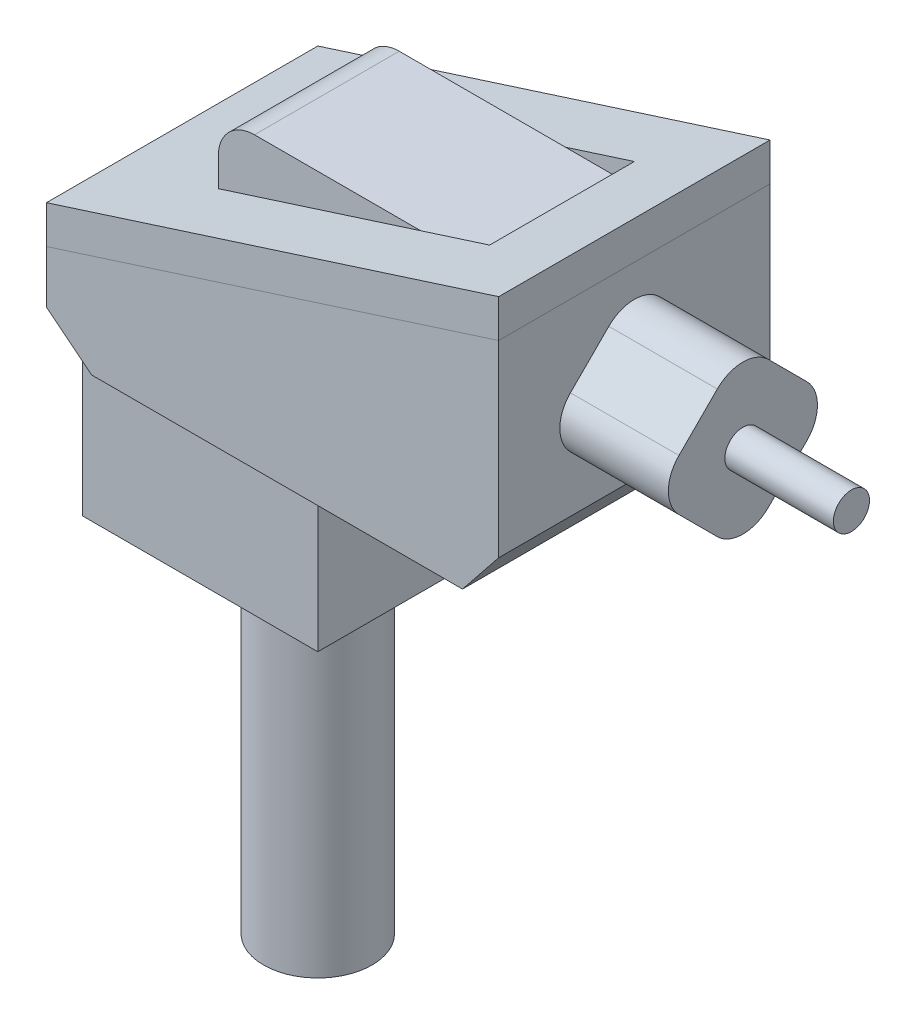
ISO-10303-21;
HEADER;
FILE_DESCRIPTION(('STEP AP214'),'2;1');
FILE_NAME('part.step','',(''),(''),'','','');
FILE_SCHEMA(('AUTOMOTIVE_DESIGN { 1 0 10303 214 1 1 1 1 }'));
ENDSEC;
DATA;
#1=APPLICATION_CONTEXT('core data for automotive mechanical design processes');
#2=APPLICATION_PROTOCOL_DEFINITION('international standard','automotive_design',2000,#1);
#3=PRODUCT_CONTEXT('',#1,'mechanical');
#4=PRODUCT('Part','Part','',(#3));
#5=PRODUCT_RELATED_PRODUCT_CATEGORY('part','',(#4));
#6=PRODUCT_DEFINITION_FORMATION('','',#4);
#7=PRODUCT_DEFINITION_CONTEXT('part definition',#1,'design');
#8=PRODUCT_DEFINITION('design','',#6,#7);
#9=PRODUCT_DEFINITION_SHAPE('','',#8);
#10=(LENGTH_UNIT() NAMED_UNIT(*) SI_UNIT(.MILLI.,.METRE.));
#11=(NAMED_UNIT(*) PLANE_ANGLE_UNIT() SI_UNIT($,.RADIAN.));
#12=(NAMED_UNIT(*) SI_UNIT($,.STERADIAN.) SOLID_ANGLE_UNIT());
#13=UNCERTAINTY_MEASURE_WITH_UNIT(LENGTH_MEASURE(1.E-05),#10,'distance_accuracy_value','');
#14=(GEOMETRIC_REPRESENTATION_CONTEXT(3) GLOBAL_UNCERTAINTY_ASSIGNED_CONTEXT((#13)) GLOBAL_UNIT_ASSIGNED_CONTEXT((#10,
#11,#12)) REPRESENTATION_CONTEXT('',''));
#15=CARTESIAN_POINT('',(0.,0.,0.));
#16=DIRECTION('',(0.,0.,1.));
#17=DIRECTION('',(1.,0.,0.));
#18=AXIS2_PLACEMENT_3D('',#15,#16,#17);
#19=CARTESIAN_POINT('',(-7.5,12.9000952402549,-7.51));
#20=DIRECTION('',(0.304775727103784,-0.952424147199324,0.));
#21=DIRECTION('',(0.952424147199324,0.304775727103784,0.));
#22=AXIS2_PLACEMENT_3D('',#19,#20,#21);
#23=PLANE('',#22);
#24=DIRECTION('',(0.,0.,-1.));
#25=VECTOR('',#24,1.);
#26=CARTESIAN_POINT('',(-7.5,12.9000952402549,7.5));
#27=LINE('',#26,#25);
#28=CARTESIAN_POINT('',(-7.5,12.9000952402549,7.5));
#29=VERTEX_POINT('',#28);
#30=CARTESIAN_POINT('',(-7.5,12.9000952402549,-7.5));
#31=VERTEX_POINT('',#30);
#32=EDGE_CURVE('E144',#29,#31,#27,.T.);
#33=ORIENTED_EDGE('',*,*,#32,.T.);
#34=DIRECTION('',(0.952424147199324,0.304775727103784,0.));
#35=VECTOR('',#34,1.);
#36=CARTESIAN_POINT('',(-4.44124680413786,13.8788962629308,-7.5));
#37=LINE('',#36,#35);
#38=CARTESIAN_POINT('',(17.5,20.9000952402549,-7.5));
#39=VERTEX_POINT('',#38);
#40=EDGE_CURVE('E130',#31,#39,#37,.T.);
#41=ORIENTED_EDGE('',*,*,#40,.T.);
#42=DIRECTION('',(0.,0.,1.));
#43=VECTOR('',#42,1.);
#44=CARTESIAN_POINT('',(17.5,20.9000952402549,7.5));
#45=LINE('',#44,#43);
#46=CARTESIAN_POINT('',(17.5,20.9000952402549,7.5));
#47=VERTEX_POINT('',#46);
#48=EDGE_CURVE('E139',#39,#47,#45,.T.);
#49=ORIENTED_EDGE('',*,*,#48,.T.);
#50=DIRECTION('',(0.952424147199324,0.304775727103784,0.));
#51=VECTOR('',#50,1.);
#52=CARTESIAN_POINT('',(-4.44124680413786,13.8788962629308,7.5));
#53=LINE('',#52,#51);
#54=EDGE_CURVE('E143',#29,#47,#53,.T.);
#55=ORIENTED_EDGE('',*,*,#54,.F.);
#56=EDGE_LOOP('',(#33,#41,#49,#55));
#57=FACE_BOUND('',#56,.T.);
#58=ADVANCED_FACE('F47',(#57),#23,.T.);
#59=CARTESIAN_POINT('',(17.5,10.5,7.5));
#60=DIRECTION('',(-1.,0.,0.));
#61=DIRECTION('',(0.,0.,1.));
#62=AXIS2_PLACEMENT_3D('',#59,#60,#61);
#63=PLANE('',#62);
#64=ORIENTED_EDGE('',*,*,#48,.F.);
#65=DIRECTION('',(0.,1.,0.));
#66=VECTOR('',#65,1.);
#67=CARTESIAN_POINT('',(17.5,10.5,-7.5));
#68=LINE('',#67,#66);
#69=CARTESIAN_POINT('',(17.5,23.,-7.5));
#70=VERTEX_POINT('',#69);
#71=EDGE_CURVE('E126',#39,#70,#68,.T.);
#72=ORIENTED_EDGE('',*,*,#71,.T.);
#73=DIRECTION('',(0.,0.,-1.));
#74=VECTOR('',#73,1.);
#75=CARTESIAN_POINT('',(17.5,23.,7.5));
#76=LINE('',#75,#74);
#77=CARTESIAN_POINT('',(17.5,23.,7.5));
#78=VERTEX_POINT('',#77);
#79=EDGE_CURVE('E153',#78,#70,#76,.T.);
#80=ORIENTED_EDGE('',*,*,#79,.F.);
#81=DIRECTION('',(0.,1.,0.));
#82=VECTOR('',#81,1.);
#83=CARTESIAN_POINT('',(17.5,10.5,7.5));
#84=LINE('',#83,#82);
#85=EDGE_CURVE('E141',#47,#78,#84,.T.);
#86=ORIENTED_EDGE('',*,*,#85,.F.);
#87=EDGE_LOOP('',(#64,#72,#80,#86));
#88=FACE_BOUND('',#87,.T.);
#89=ADVANCED_FACE('F140',(#88),#63,.F.);
#90=CARTESIAN_POINT('',(-7.5,15.,7.5));
#91=DIRECTION('',(1.,0.,0.));
#92=DIRECTION('',(0.,1.,0.));
#93=AXIS2_PLACEMENT_3D('',#90,#91,#92);
#94=PLANE('',#93);
#95=ORIENTED_EDGE('',*,*,#32,.F.);
#96=DIRECTION('',(0.,-1.,0.));
#97=VECTOR('',#96,1.);
#98=CARTESIAN_POINT('',(-7.5,15.,7.5));
#99=LINE('',#98,#97);
#100=CARTESIAN_POINT('',(-7.5,15.,7.5));
#101=VERTEX_POINT('',#100);
#102=EDGE_CURVE('E152',#101,#29,#99,.T.);
#103=ORIENTED_EDGE('',*,*,#102,.F.);
#104=DIRECTION('',(0.,0.,-1.));
#105=VECTOR('',#104,1.);
#106=CARTESIAN_POINT('',(-7.5,15.,7.5));
#107=LINE('',#106,#105);
#108=CARTESIAN_POINT('',(-7.5,15.,-7.5));
#109=VERTEX_POINT('',#108);
#110=EDGE_CURVE('E207',#101,#109,#107,.T.);
#111=ORIENTED_EDGE('',*,*,#110,.T.);
#112=DIRECTION('',(0.,-1.,0.));
#113=VECTOR('',#112,1.);
#114=CARTESIAN_POINT('',(-7.5,15.,-7.5));
#115=LINE('',#114,#113);
#116=EDGE_CURVE('E51',#109,#31,#115,.T.);
#117=ORIENTED_EDGE('',*,*,#116,.T.);
#118=EDGE_LOOP('',(#95,#103,#111,#117));
#119=FACE_BOUND('',#118,.T.);
#120=ADVANCED_FACE('F213',(#119),#94,.F.);
#121=CARTESIAN_POINT('',(0.,0.,7.5));
#122=DIRECTION('',(0.,0.,1.));
#123=DIRECTION('',(1.,0.,0.));
#124=AXIS2_PLACEMENT_3D('',#121,#122,#123);
#125=PLANE('',#124);
#126=ORIENTED_EDGE('',*,*,#102,.T.);
#127=ORIENTED_EDGE('',*,*,#54,.T.);
#128=ORIENTED_EDGE('',*,*,#85,.T.);
#129=DIRECTION('',(-0.952424147199324,-0.304775727103784,0.));
#130=VECTOR('',#129,1.);
#131=CARTESIAN_POINT('',(17.5,23.,7.5));
#132=LINE('',#131,#130);
#133=EDGE_CURVE('E136',#78,#101,#132,.T.);
#134=ORIENTED_EDGE('',*,*,#133,.T.);
#135=EDGE_LOOP('',(#126,#127,#128,#134));
#136=FACE_BOUND('',#135,.T.);
#137=ADVANCED_FACE('F49',(#136),#125,.T.);
#138=CARTESIAN_POINT('',(0.,0.,-7.5));
#139=DIRECTION('',(0.,0.,1.));
#140=DIRECTION('',(1.,0.,0.));
#141=AXIS2_PLACEMENT_3D('',#138,#139,#140);
#142=PLANE('',#141);
#143=ORIENTED_EDGE('',*,*,#40,.F.);
#144=ORIENTED_EDGE('',*,*,#116,.F.);
#145=DIRECTION('',(-0.952424147199324,-0.304775727103784,0.));
#146=VECTOR('',#145,1.);
#147=CARTESIAN_POINT('',(17.5,23.,-7.5));
#148=LINE('',#147,#146);
#149=EDGE_CURVE('E132',#70,#109,#148,.T.);
#150=ORIENTED_EDGE('',*,*,#149,.F.);
#151=ORIENTED_EDGE('',*,*,#71,.F.);
#152=EDGE_LOOP('',(#143,#144,#150,#151));
#153=FACE_BOUND('',#152,.T.);
#154=ADVANCED_FACE('F128',(#153),#142,.F.);
#155=CARTESIAN_POINT('',(17.5,23.,7.5));
#156=DIRECTION('',(0.304775727103784,-0.952424147199324,0.));
#157=DIRECTION('',(0.952424147199324,0.304775727103784,0.));
#158=AXIS2_PLACEMENT_3D('',#155,#156,#157);
#159=PLANE('',#158);
#160=ORIENTED_EDGE('',*,*,#149,.T.);
#161=ORIENTED_EDGE('',*,*,#110,.F.);
#162=ORIENTED_EDGE('',*,*,#133,.F.);
#163=ORIENTED_EDGE('',*,*,#79,.T.);
#164=EDGE_LOOP('',(#160,#161,#162,#163));
#165=FACE_BOUND('',#164,.T.);
#166=DIRECTION('',(0.952424147199324,0.304775727103784,0.));
#167=VECTOR('',#166,1.);
#168=CARTESIAN_POINT('',(17.5,23.,4.));
#169=LINE('',#168,#167);
#170=CARTESIAN_POINT('',(9.6875,20.5,4.));
#171=VERTEX_POINT('',#170);
#172=CARTESIAN_POINT('',(13.5,21.72,4.));
#173=VERTEX_POINT('',#172);
#174=EDGE_CURVE('E173',#171,#173,#169,.T.);
#175=ORIENTED_EDGE('',*,*,#174,.F.);
#176=DIRECTION('',(0.952424147199324,0.304775727103784,0.));
#177=VECTOR('',#176,1.);
#178=CARTESIAN_POINT('',(17.5,23.,4.));
#179=LINE('',#178,#177);
#180=CARTESIAN_POINT('',(-1.5,16.92,4.));
#181=VERTEX_POINT('',#180);
#182=EDGE_CURVE('E201',#181,#171,#179,.T.);
#183=ORIENTED_EDGE('',*,*,#182,.F.);
#184=DIRECTION('',(0.,0.,-1.));
#185=VECTOR('',#184,1.);
#186=CARTESIAN_POINT('',(-1.5,16.92,4.));
#187=LINE('',#186,#185);
#188=CARTESIAN_POINT('',(-1.5,16.92,-4.));
#189=VERTEX_POINT('',#188);
#190=EDGE_CURVE('E163',#181,#189,#187,.T.);
#191=ORIENTED_EDGE('',*,*,#190,.T.);
#192=DIRECTION('',(0.952424147199324,0.304775727103784,0.));
#193=VECTOR('',#192,1.);
#194=CARTESIAN_POINT('',(17.5,23.,-4.));
#195=LINE('',#194,#193);
#196=CARTESIAN_POINT('',(9.68750000000001,20.5,-4.));
#197=VERTEX_POINT('',#196);
#198=EDGE_CURVE('E204',#189,#197,#195,.T.);
#199=ORIENTED_EDGE('',*,*,#198,.T.);
#200=DIRECTION('',(-0.952424147199324,-0.304775727103784,0.));
#201=VECTOR('',#200,1.);
#202=CARTESIAN_POINT('',(17.5,23.,-4.));
#203=LINE('',#202,#201);
#204=CARTESIAN_POINT('',(13.5,21.72,-4.));
#205=VERTEX_POINT('',#204);
#206=EDGE_CURVE('E178',#205,#197,#203,.T.);
#207=ORIENTED_EDGE('',*,*,#206,.F.);
#208=DIRECTION('',(0.,0.,-1.));
#209=VECTOR('',#208,1.);
#210=CARTESIAN_POINT('',(13.5,21.72,7.5));
#211=LINE('',#210,#209);
#212=EDGE_CURVE('E199',#173,#205,#211,.T.);
#213=ORIENTED_EDGE('',*,*,#212,.F.);
#214=EDGE_LOOP('',(#175,#183,#191,#199,#207,#213));
#215=FACE_BOUND('',#214,.T.);
#216=ADVANCED_FACE('F210',(#165,#215),#159,.F.);
#217=CARTESIAN_POINT('',(0.,0.,4.));
#218=DIRECTION('',(0.,0.,-1.));
#219=DIRECTION('',(-1.,0.,0.));
#220=AXIS2_PLACEMENT_3D('',#217,#218,#219);
#221=PLANE('',#220);
#222=DIRECTION('',(-1.,0.,0.));
#223=VECTOR('',#222,1.);
#224=CARTESIAN_POINT('',(9.68750000000001,20.5,4.));
#225=LINE('',#224,#223);
#226=CARTESIAN_POINT('',(0.500000000000006,20.5,4.));
#227=VERTEX_POINT('',#226);
#228=EDGE_CURVE('E170',#171,#227,#225,.T.);
#229=ORIENTED_EDGE('',*,*,#228,.T.);
#230=CARTESIAN_POINT('',(0.500000000000002,18.5,4.));
#231=DIRECTION('',(0.,0.,-1.));
#232=DIRECTION('',(-1.,0.,0.));
#233=AXIS2_PLACEMENT_3D('',#230,#231,#232);
#234=CIRCLE('',#233,2.);
#235=CARTESIAN_POINT('',(-1.5,18.5,4.));
#236=VERTEX_POINT('',#235);
#237=EDGE_CURVE('E186',#227,#236,#234,.F.);
#238=ORIENTED_EDGE('',*,*,#237,.T.);
#239=DIRECTION('',(0.,-1.,0.));
#240=VECTOR('',#239,1.);
#241=CARTESIAN_POINT('',(-1.5,20.5,4.));
#242=LINE('',#241,#240);
#243=EDGE_CURVE('E166',#236,#181,#242,.T.);
#244=ORIENTED_EDGE('',*,*,#243,.T.);
#245=ORIENTED_EDGE('',*,*,#182,.T.);
#246=EDGE_LOOP('',(#229,#238,#244,#245));
#247=FACE_BOUND('',#246,.T.);
#248=ADVANCED_FACE('F226',(#247),#221,.F.);
#249=CARTESIAN_POINT('',(0.,0.,-4.));
#250=DIRECTION('',(0.,0.,-1.));
#251=DIRECTION('',(-1.,0.,0.));
#252=AXIS2_PLACEMENT_3D('',#249,#250,#251);
#253=PLANE('',#252);
#254=DIRECTION('',(0.,-1.,0.));
#255=VECTOR('',#254,1.);
#256=CARTESIAN_POINT('',(-1.5,20.5,-4.));
#257=LINE('',#256,#255);
#258=CARTESIAN_POINT('',(-1.5,18.5,-4.));
#259=VERTEX_POINT('',#258);
#260=EDGE_CURVE('E167',#259,#189,#257,.T.);
#261=ORIENTED_EDGE('',*,*,#260,.F.);
#262=CARTESIAN_POINT('',(0.500000000000002,18.5,-4.));
#263=DIRECTION('',(0.,0.,-1.));
#264=DIRECTION('',(-1.,0.,0.));
#265=AXIS2_PLACEMENT_3D('',#262,#263,#264);
#266=CIRCLE('',#265,2.);
#267=CARTESIAN_POINT('',(0.500000000000006,20.5,-4.));
#268=VERTEX_POINT('',#267);
#269=EDGE_CURVE('E192',#259,#268,#266,.T.);
#270=ORIENTED_EDGE('',*,*,#269,.T.);
#271=DIRECTION('',(-1.,0.,0.));
#272=VECTOR('',#271,1.);
#273=CARTESIAN_POINT('',(9.68750000000001,20.5,-4.));
#274=LINE('',#273,#272);
#275=EDGE_CURVE('E169',#197,#268,#274,.T.);
#276=ORIENTED_EDGE('',*,*,#275,.F.);
#277=ORIENTED_EDGE('',*,*,#198,.F.);
#278=EDGE_LOOP('',(#261,#270,#276,#277));
#279=FACE_BOUND('',#278,.T.);
#280=ADVANCED_FACE('F231',(#279),#253,.T.);
#281=CARTESIAN_POINT('',(9.68750000000001,20.5,4.));
#282=DIRECTION('',(0.,-1.,0.));
#283=DIRECTION('',(0.,0.,-1.));
#284=AXIS2_PLACEMENT_3D('',#281,#282,#283);
#285=PLANE('',#284);
#286=ORIENTED_EDGE('',*,*,#275,.T.);
#287=DIRECTION('',(0.,0.,-1.));
#288=VECTOR('',#287,1.);
#289=CARTESIAN_POINT('',(0.500000000000002,20.5,4.));
#290=LINE('',#289,#288);
#291=EDGE_CURVE('E187',#268,#227,#290,.F.);
#292=ORIENTED_EDGE('',*,*,#291,.T.);
#293=ORIENTED_EDGE('',*,*,#228,.F.);
#294=DIRECTION('',(1.,0.,0.));
#295=VECTOR('',#294,1.);
#296=CARTESIAN_POINT('',(-1.5,20.5,4.));
#297=LINE('',#296,#295);
#298=CARTESIAN_POINT('',(13.5,20.5,4.));
#299=VERTEX_POINT('',#298);
#300=EDGE_CURVE('E12',#171,#299,#297,.T.);
#301=ORIENTED_EDGE('',*,*,#300,.T.);
#302=DIRECTION('',(0.,0.,-1.));
#303=VECTOR('',#302,1.);
#304=CARTESIAN_POINT('',(13.5,20.5,-4.));
#305=LINE('',#304,#303);
#306=CARTESIAN_POINT('',(13.5,20.5,-4.));
#307=VERTEX_POINT('',#306);
#308=EDGE_CURVE('E56',#299,#307,#305,.T.);
#309=ORIENTED_EDGE('',*,*,#308,.T.);
#310=DIRECTION('',(-1.,0.,0.));
#311=VECTOR('',#310,1.);
#312=CARTESIAN_POINT('',(-1.5,20.5,-4.));
#313=LINE('',#312,#311);
#314=EDGE_CURVE('E183',#307,#197,#313,.T.);
#315=ORIENTED_EDGE('',*,*,#314,.T.);
#316=EDGE_LOOP('',(#286,#292,#293,#301,#309,#315));
#317=FACE_BOUND('',#316,.T.);
#318=ADVANCED_FACE('F236',(#317),#285,.F.);
#319=CARTESIAN_POINT('',(-1.5,20.5,4.));
#320=DIRECTION('',(1.,0.,0.));
#321=DIRECTION('',(0.,0.,-1.));
#322=AXIS2_PLACEMENT_3D('',#319,#320,#321);
#323=PLANE('',#322);
#324=ORIENTED_EDGE('',*,*,#243,.F.);
#325=DIRECTION('',(0.,0.,-1.));
#326=VECTOR('',#325,1.);
#327=CARTESIAN_POINT('',(-1.5,18.5,4.));
#328=LINE('',#327,#326);
#329=EDGE_CURVE('E196',#236,#259,#328,.T.);
#330=ORIENTED_EDGE('',*,*,#329,.T.);
#331=ORIENTED_EDGE('',*,*,#260,.T.);
#332=ORIENTED_EDGE('',*,*,#190,.F.);
#333=EDGE_LOOP('',(#324,#330,#331,#332));
#334=FACE_BOUND('',#333,.T.);
#335=ADVANCED_FACE('F239',(#334),#323,.F.);
#336=CARTESIAN_POINT('',(13.5,23.,-4.));
#337=DIRECTION('',(-1.,0.,0.));
#338=DIRECTION('',(0.,0.,1.));
#339=AXIS2_PLACEMENT_3D('',#336,#337,#338);
#340=PLANE('',#339);
#341=ORIENTED_EDGE('',*,*,#212,.T.);
#342=DIRECTION('',(0.,-1.,0.));
#343=VECTOR('',#342,1.);
#344=CARTESIAN_POINT('',(13.5,23.,-4.));
#345=LINE('',#344,#343);
#346=EDGE_CURVE('E71',#205,#307,#345,.T.);
#347=ORIENTED_EDGE('',*,*,#346,.T.);
#348=ORIENTED_EDGE('',*,*,#308,.F.);
#349=DIRECTION('',(0.,-1.,0.));
#350=VECTOR('',#349,1.);
#351=CARTESIAN_POINT('',(13.5,23.,4.));
#352=LINE('',#351,#350);
#353=EDGE_CURVE('E64',#173,#299,#352,.T.);
#354=ORIENTED_EDGE('',*,*,#353,.F.);
#355=EDGE_LOOP('',(#341,#347,#348,#354));
#356=FACE_BOUND('',#355,.T.);
#357=ADVANCED_FACE('F243',(#356),#340,.T.);
#358=CARTESIAN_POINT('',(-1.5,23.,4.));
#359=DIRECTION('',(0.,0.,-1.));
#360=DIRECTION('',(-1.,0.,0.));
#361=AXIS2_PLACEMENT_3D('',#358,#359,#360);
#362=PLANE('',#361);
#363=ORIENTED_EDGE('',*,*,#174,.T.);
#364=ORIENTED_EDGE('',*,*,#353,.T.);
#365=ORIENTED_EDGE('',*,*,#300,.F.);
#366=EDGE_LOOP('',(#363,#364,#365));
#367=FACE_BOUND('',#366,.T.);
#368=ADVANCED_FACE('F248',(#367),#362,.T.);
#369=CARTESIAN_POINT('',(-1.5,23.,-4.));
#370=DIRECTION('',(0.,0.,1.));
#371=DIRECTION('',(1.,0.,0.));
#372=AXIS2_PLACEMENT_3D('',#369,#370,#371);
#373=PLANE('',#372);
#374=ORIENTED_EDGE('',*,*,#206,.T.);
#375=ORIENTED_EDGE('',*,*,#314,.F.);
#376=ORIENTED_EDGE('',*,*,#346,.F.);
#377=EDGE_LOOP('',(#374,#375,#376));
#378=FACE_BOUND('',#377,.T.);
#379=ADVANCED_FACE('F251',(#378),#373,.T.);
#380=CARTESIAN_POINT('',(0.500000000000002,18.5,4.));
#381=DIRECTION('',(0.,0.,-1.));
#382=DIRECTION('',(-1.,0.,0.));
#383=AXIS2_PLACEMENT_3D('',#380,#381,#382);
#384=CYLINDRICAL_SURFACE('',#383,2.);
#385=ORIENTED_EDGE('',*,*,#237,.F.);
#386=ORIENTED_EDGE('',*,*,#291,.F.);
#387=ORIENTED_EDGE('',*,*,#269,.F.);
#388=ORIENTED_EDGE('',*,*,#329,.F.);
#389=EDGE_LOOP('',(#385,#386,#387,#388));
#390=FACE_BOUND('',#389,.T.);
#391=ADVANCED_FACE('F235',(#390),#384,.T.);
#392=CLOSED_SHELL('',(#58,#89,#120,#137,#154,#216,#248,#280,#318,#335,#357,#368,#379,#391));
#393=MANIFOLD_SOLID_BREP('B2',#392);
#394=CARTESIAN_POINT('',(-7.5,12.9000952402549,-7.51));
#395=DIRECTION('',(0.304775727103784,-0.952424147199324,0.));
#396=DIRECTION('',(0.952424147199324,0.304775727103784,0.));
#397=AXIS2_PLACEMENT_3D('',#394,#395,#396);
#398=PLANE('',#397);
#399=DIRECTION('',(0.,0.,-1.));
#400=VECTOR('',#399,1.);
#401=CARTESIAN_POINT('',(-7.5,12.9000952402549,7.5));
#402=LINE('',#401,#400);
#403=CARTESIAN_POINT('',(-7.5,12.9000952402549,7.5));
#404=VERTEX_POINT('',#403);
#405=CARTESIAN_POINT('',(-7.5,12.9000952402549,-7.5));
#406=VERTEX_POINT('',#405);
#407=EDGE_CURVE('E612',#404,#406,#402,.T.);
#408=ORIENTED_EDGE('',*,*,#407,.F.);
#409=DIRECTION('',(0.952424147199324,0.304775727103784,0.));
#410=VECTOR('',#409,1.);
#411=CARTESIAN_POINT('',(-4.44124680413786,13.8788962629308,7.5));
#412=LINE('',#411,#410);
#413=CARTESIAN_POINT('',(17.5,20.9000952402549,7.5));
#414=VERTEX_POINT('',#413);
#415=EDGE_CURVE('E45',#404,#414,#412,.T.);
#416=ORIENTED_EDGE('',*,*,#415,.T.);
#417=DIRECTION('',(0.,0.,1.));
#418=VECTOR('',#417,1.);
#419=CARTESIAN_POINT('',(17.5,20.9000952402549,7.5));
#420=LINE('',#419,#418);
#421=CARTESIAN_POINT('',(17.5,20.9000952402549,-7.5));
#422=VERTEX_POINT('',#421);
#423=EDGE_CURVE('E357',#422,#414,#420,.T.);
#424=ORIENTED_EDGE('',*,*,#423,.F.);
#425=DIRECTION('',(0.952424147199324,0.304775727103784,0.));
#426=VECTOR('',#425,1.);
#427=CARTESIAN_POINT('',(-4.44124680413786,13.8788962629308,-7.5));
#428=LINE('',#427,#426);
#429=EDGE_CURVE('E611',#406,#422,#428,.T.);
#430=ORIENTED_EDGE('',*,*,#429,.F.);
#431=EDGE_LOOP('',(#408,#416,#424,#430));
#432=FACE_BOUND('',#431,.T.);
#433=ADVANCED_FACE('F354',(#432),#398,.F.);
#434=CARTESIAN_POINT('',(0.,-20.,0.));
#435=DIRECTION('',(0.,1.,0.));
#436=DIRECTION('',(0.,0.,1.));
#437=AXIS2_PLACEMENT_3D('',#434,#435,#436);
#438=PLANE('',#437);
#439=CARTESIAN_POINT('',(0.,-20.,0.));
#440=DIRECTION('',(0.,1.,0.));
#441=DIRECTION('',(0.,0.,1.));
#442=AXIS2_PLACEMENT_3D('',#439,#440,#441);
#443=CIRCLE('',#442,3.);
#444=CARTESIAN_POINT('',(0.,-20.,3.));
#445=VERTEX_POINT('',#444);
#446=EDGE_CURVE('E566',#445,#445,#443,.T.);
#447=ORIENTED_EDGE('',*,*,#446,.F.);
#448=EDGE_LOOP('',(#447));
#449=FACE_BOUND('',#448,.T.);
#450=ADVANCED_FACE('F727',(#449),#438,.F.);
#451=CARTESIAN_POINT('',(29.5,15.,0.));
#452=DIRECTION('',(1.,0.,0.));
#453=DIRECTION('',(0.,0.,-1.));
#454=AXIS2_PLACEMENT_3D('',#451,#452,#453);
#455=PLANE('',#454);
#456=CARTESIAN_POINT('',(29.5,15.,0.));
#457=DIRECTION('',(1.,0.,0.));
#458=DIRECTION('',(0.,0.,-1.));
#459=AXIS2_PLACEMENT_3D('',#456,#457,#458);
#460=CIRCLE('',#459,1.);
#461=CARTESIAN_POINT('',(29.5,15.,-1.));
#462=VERTEX_POINT('',#461);
#463=EDGE_CURVE('E674',#462,#462,#460,.T.);
#464=ORIENTED_EDGE('',*,*,#463,.T.);
#465=EDGE_LOOP('',(#464));
#466=FACE_BOUND('',#465,.T.);
#467=ADVANCED_FACE('F732',(#466),#455,.T.);
#468=CARTESIAN_POINT('',(0.,-20.,0.));
#469=DIRECTION('',(0.,1.,0.));
#470=DIRECTION('',(0.,0.,1.));
#471=AXIS2_PLACEMENT_3D('',#468,#469,#470);
#472=CYLINDRICAL_SURFACE('',#471,3.);
#473=ORIENTED_EDGE('',*,*,#446,.T.);
#474=EDGE_LOOP('',(#473));
#475=FACE_BOUND('',#474,.T.);
#476=CARTESIAN_POINT('',(0.,0.,0.));
#477=DIRECTION('',(0.,1.,0.));
#478=DIRECTION('',(0.,0.,1.));
#479=AXIS2_PLACEMENT_3D('',#476,#477,#478);
#480=CIRCLE('',#479,3.);
#481=CARTESIAN_POINT('',(0.,0.,3.));
#482=VERTEX_POINT('',#481);
#483=EDGE_CURVE('E565',#482,#482,#480,.T.);
#484=ORIENTED_EDGE('',*,*,#483,.F.);
#485=EDGE_LOOP('',(#484));
#486=FACE_BOUND('',#485,.T.);
#487=ADVANCED_FACE('F767',(#475,#486),#472,.T.);
#488=CARTESIAN_POINT('',(29.5,15.,0.));
#489=DIRECTION('',(-1.,0.,0.));
#490=DIRECTION('',(0.,0.,1.));
#491=AXIS2_PLACEMENT_3D('',#488,#489,#490);
#492=CYLINDRICAL_SURFACE('',#491,1.);
#493=ORIENTED_EDGE('',*,*,#463,.F.);
#494=EDGE_LOOP('',(#493));
#495=FACE_BOUND('',#494,.T.);
#496=CARTESIAN_POINT('',(23.5,15.,0.));
#497=DIRECTION('',(-1.,0.,0.));
#498=DIRECTION('',(0.,0.,1.));
#499=AXIS2_PLACEMENT_3D('',#496,#497,#498);
#500=CIRCLE('',#499,1.);
#501=CARTESIAN_POINT('',(23.5,15.,1.));
#502=VERTEX_POINT('',#501);
#503=EDGE_CURVE('E571',#502,#502,#500,.F.);
#504=ORIENTED_EDGE('',*,*,#503,.T.);
#505=EDGE_LOOP('',(#504));
#506=FACE_BOUND('',#505,.T.);
#507=ADVANCED_FACE('F760',(#495,#506),#492,.T.);
#508=CARTESIAN_POINT('',(-6.5,8.,6.5));
#509=DIRECTION('',(1.,0.,0.));
#510=DIRECTION('',(0.,0.,-1.));
#511=AXIS2_PLACEMENT_3D('',#508,#509,#510);
#512=PLANE('',#511);
#513=DIRECTION('',(0.,0.,1.));
#514=VECTOR('',#513,1.);
#515=CARTESIAN_POINT('',(-6.5,0.,6.5));
#516=LINE('',#515,#514);
#517=CARTESIAN_POINT('',(-6.5,0.,-6.5));
#518=VERTEX_POINT('',#517);
#519=CARTESIAN_POINT('',(-6.5,0.,6.5));
#520=VERTEX_POINT('',#519);
#521=EDGE_CURVE('E551',#518,#520,#516,.T.);
#522=ORIENTED_EDGE('',*,*,#521,.T.);
#523=DIRECTION('',(0.,-1.,0.));
#524=VECTOR('',#523,1.);
#525=CARTESIAN_POINT('',(-6.5,8.,6.5));
#526=LINE('',#525,#524);
#527=CARTESIAN_POINT('',(-6.5,8.,6.5));
#528=VERTEX_POINT('',#527);
#529=EDGE_CURVE('E556',#528,#520,#526,.T.);
#530=ORIENTED_EDGE('',*,*,#529,.F.);
#531=DIRECTION('',(0.,0.,1.));
#532=VECTOR('',#531,1.);
#533=CARTESIAN_POINT('',(-6.5,8.,6.5));
#534=LINE('',#533,#532);
#535=CARTESIAN_POINT('',(-6.5,8.,-6.5));
#536=VERTEX_POINT('',#535);
#537=EDGE_CURVE('E540',#536,#528,#534,.T.);
#538=ORIENTED_EDGE('',*,*,#537,.F.);
#539=DIRECTION('',(0.,-1.,0.));
#540=VECTOR('',#539,1.);
#541=CARTESIAN_POINT('',(-6.5,8.,-6.5));
#542=LINE('',#541,#540);
#543=EDGE_CURVE('E559',#536,#518,#542,.T.);
#544=ORIENTED_EDGE('',*,*,#543,.T.);
#545=EDGE_LOOP('',(#522,#530,#538,#544));
#546=FACE_BOUND('',#545,.T.);
#547=ADVANCED_FACE('F636',(#546),#512,.F.);
#548=CARTESIAN_POINT('',(0.,0.,0.));
#549=DIRECTION('',(0.,-1.,0.));
#550=DIRECTION('',(0.,0.,-1.));
#551=AXIS2_PLACEMENT_3D('',#548,#549,#550);
#552=PLANE('',#551);
#553=ORIENTED_EDGE('',*,*,#483,.T.);
#554=EDGE_LOOP('',(#553));
#555=FACE_BOUND('',#554,.T.);
#556=DIRECTION('',(0.,0.,-1.));
#557=VECTOR('',#556,1.);
#558=CARTESIAN_POINT('',(6.5,0.,6.5));
#559=LINE('',#558,#557);
#560=CARTESIAN_POINT('',(6.5,0.,6.5));
#561=VERTEX_POINT('',#560);
#562=CARTESIAN_POINT('',(6.5,0.,-6.5));
#563=VERTEX_POINT('',#562);
#564=EDGE_CURVE('E500',#561,#563,#559,.T.);
#565=ORIENTED_EDGE('',*,*,#564,.F.);
#566=DIRECTION('',(1.,0.,0.));
#567=VECTOR('',#566,1.);
#568=CARTESIAN_POINT('',(-6.5,0.,6.5));
#569=LINE('',#568,#567);
#570=EDGE_CURVE('E536',#520,#561,#569,.T.);
#571=ORIENTED_EDGE('',*,*,#570,.F.);
#572=ORIENTED_EDGE('',*,*,#521,.F.);
#573=DIRECTION('',(-1.,0.,0.));
#574=VECTOR('',#573,1.);
#575=CARTESIAN_POINT('',(-6.5,0.,-6.5));
#576=LINE('',#575,#574);
#577=EDGE_CURVE('E549',#563,#518,#576,.T.);
#578=ORIENTED_EDGE('',*,*,#577,.F.);
#579=EDGE_LOOP('',(#565,#571,#572,#578));
#580=FACE_BOUND('',#579,.T.);
#581=ADVANCED_FACE('F752',(#555,#580),#552,.T.);
#582=CARTESIAN_POINT('',(23.5,0.,0.));
#583=DIRECTION('',(-1.,0.,0.));
#584=DIRECTION('',(0.,0.,1.));
#585=AXIS2_PLACEMENT_3D('',#582,#583,#584);
#586=PLANE('',#585);
#587=DIRECTION('',(0.,-0.707106781186548,-0.707106781186548));
#588=VECTOR('',#587,1.);
#589=CARTESIAN_POINT('',(23.5,15.,4.94974746830584));
#590=LINE('',#589,#588);
#591=CARTESIAN_POINT('',(23.5,13.5857864376269,3.53553390593274));
#592=VERTEX_POINT('',#591);
#593=CARTESIAN_POINT('',(23.5,11.4644660940673,1.4142135623731));
#594=VERTEX_POINT('',#593);
#595=EDGE_CURVE('E668',#592,#594,#590,.T.);
#596=ORIENTED_EDGE('',*,*,#595,.T.);
#597=CARTESIAN_POINT('',(23.5,12.8786796564404,0.));
#598=DIRECTION('',(-1.,0.,0.));
#599=DIRECTION('',(0.,0.,1.));
#600=AXIS2_PLACEMENT_3D('',#597,#598,#599);
#601=CIRCLE('',#600,2.);
#602=CARTESIAN_POINT('',(23.5,11.4644660940673,-1.41421356237309));
#603=VERTEX_POINT('',#602);
#604=EDGE_CURVE('E591',#594,#603,#601,.F.);
#605=ORIENTED_EDGE('',*,*,#604,.T.);
#606=DIRECTION('',(0.,0.707106781186548,-0.707106781186547));
#607=VECTOR('',#606,1.);
#608=CARTESIAN_POINT('',(23.5,10.0502525316942,0.));
#609=LINE('',#608,#607);
#610=CARTESIAN_POINT('',(23.5,13.5857864376269,-3.53553390593274));
#611=VERTEX_POINT('',#610);
#612=EDGE_CURVE('E683',#603,#611,#609,.T.);
#613=ORIENTED_EDGE('',*,*,#612,.T.);
#614=CARTESIAN_POINT('',(23.5,15.,-2.12132034355964));
#615=DIRECTION('',(-1.,0.,0.));
#616=DIRECTION('',(0.,0.,1.));
#617=AXIS2_PLACEMENT_3D('',#614,#615,#616);
#618=CIRCLE('',#617,2.);
#619=CARTESIAN_POINT('',(23.5,16.4142135623731,-3.53553390593273));
#620=VERTEX_POINT('',#619);
#621=EDGE_CURVE('E589',#611,#620,#618,.F.);
#622=ORIENTED_EDGE('',*,*,#621,.T.);
#623=DIRECTION('',(0.,0.707106781186548,0.707106781186547));
#624=VECTOR('',#623,1.);
#625=CARTESIAN_POINT('',(23.5,19.9497474683058,0.));
#626=LINE('',#625,#624);
#627=CARTESIAN_POINT('',(23.5,18.5355339059327,-1.41421356237309));
#628=VERTEX_POINT('',#627);
#629=EDGE_CURVE('E518',#620,#628,#626,.T.);
#630=ORIENTED_EDGE('',*,*,#629,.T.);
#631=CARTESIAN_POINT('',(23.5,17.1213203435596,0.));
#632=DIRECTION('',(-1.,0.,0.));
#633=DIRECTION('',(0.,0.,1.));
#634=AXIS2_PLACEMENT_3D('',#631,#632,#633);
#635=CIRCLE('',#634,2.);
#636=CARTESIAN_POINT('',(23.5,18.5355339059327,1.4142135623731));
#637=VERTEX_POINT('',#636);
#638=EDGE_CURVE('E587',#628,#637,#635,.F.);
#639=ORIENTED_EDGE('',*,*,#638,.T.);
#640=DIRECTION('',(0.,-0.707106781186548,0.707106781186547));
#641=VECTOR('',#640,1.);
#642=CARTESIAN_POINT('',(23.5,15.,4.94974746830584));
#643=LINE('',#642,#641);
#644=CARTESIAN_POINT('',(23.5,16.4142135623731,3.53553390593274));
#645=VERTEX_POINT('',#644);
#646=EDGE_CURVE('E664',#637,#645,#643,.T.);
#647=ORIENTED_EDGE('',*,*,#646,.T.);
#648=CARTESIAN_POINT('',(23.5,15.,2.12132034355965));
#649=DIRECTION('',(-1.,0.,0.));
#650=DIRECTION('',(0.,0.,1.));
#651=AXIS2_PLACEMENT_3D('',#648,#649,#650);
#652=CIRCLE('',#651,2.);
#653=EDGE_CURVE('E585',#645,#592,#652,.F.);
#654=ORIENTED_EDGE('',*,*,#653,.T.);
#655=EDGE_LOOP('',(#596,#605,#613,#622,#630,#639,#647,#654));
#656=FACE_BOUND('',#655,.T.);
#657=ORIENTED_EDGE('',*,*,#503,.F.);
#658=EDGE_LOOP('',(#657));
#659=FACE_BOUND('',#658,.T.);
#660=ADVANCED_FACE('F690',(#656,#659),#586,.F.);
#661=CARTESIAN_POINT('',(0.,8.,0.));
#662=DIRECTION('',(0.,-1.,0.));
#663=DIRECTION('',(0.,0.,-1.));
#664=AXIS2_PLACEMENT_3D('',#661,#662,#663);
#665=PLANE('',#664);
#666=DIRECTION('',(1.,0.,0.));
#667=VECTOR('',#666,1.);
#668=CARTESIAN_POINT('',(-6.5,8.,6.5));
#669=LINE('',#668,#667);
#670=CARTESIAN_POINT('',(-5.,8.,6.5));
#671=VERTEX_POINT('',#670);
#672=EDGE_CURVE('E543',#528,#671,#669,.T.);
#673=ORIENTED_EDGE('',*,*,#672,.T.);
#674=DIRECTION('',(0.,0.,-1.));
#675=VECTOR('',#674,1.);
#676=CARTESIAN_POINT('',(-5.,8.,7.5));
#677=LINE('',#676,#675);
#678=CARTESIAN_POINT('',(-5.,8.,-6.5));
#679=VERTEX_POINT('',#678);
#680=EDGE_CURVE('E531',#671,#679,#677,.T.);
#681=ORIENTED_EDGE('',*,*,#680,.T.);
#682=DIRECTION('',(-1.,0.,0.));
#683=VECTOR('',#682,1.);
#684=CARTESIAN_POINT('',(-6.5,8.,-6.5));
#685=LINE('',#684,#683);
#686=EDGE_CURVE('E535',#679,#536,#685,.T.);
#687=ORIENTED_EDGE('',*,*,#686,.T.);
#688=ORIENTED_EDGE('',*,*,#537,.T.);
#689=EDGE_LOOP('',(#673,#681,#687,#688));
#690=FACE_BOUND('',#689,.T.);
#691=ADVANCED_FACE('F628',(#690),#665,.F.);
#692=CARTESIAN_POINT('',(-6.5,8.,6.5));
#693=DIRECTION('',(0.,0.,-1.));
#694=DIRECTION('',(-1.,0.,0.));
#695=AXIS2_PLACEMENT_3D('',#692,#693,#694);
#696=PLANE('',#695);
#697=ORIENTED_EDGE('',*,*,#570,.T.);
#698=DIRECTION('',(0.,-1.,0.));
#699=VECTOR('',#698,1.);
#700=CARTESIAN_POINT('',(6.5,8.,6.5));
#701=LINE('',#700,#699);
#702=CARTESIAN_POINT('',(6.5,8.,6.5));
#703=VERTEX_POINT('',#702);
#704=EDGE_CURVE('E546',#703,#561,#701,.T.);
#705=ORIENTED_EDGE('',*,*,#704,.F.);
#706=EDGE_CURVE('E542',#671,#703,#669,.T.);
#707=ORIENTED_EDGE('',*,*,#706,.F.);
#708=ORIENTED_EDGE('',*,*,#672,.F.);
#709=ORIENTED_EDGE('',*,*,#529,.T.);
#710=EDGE_LOOP('',(#697,#705,#707,#708,#709));
#711=FACE_BOUND('',#710,.T.);
#712=ADVANCED_FACE('F640',(#711),#696,.F.);
#713=CARTESIAN_POINT('',(-6.5,8.,-6.5));
#714=DIRECTION('',(0.,0.,1.));
#715=DIRECTION('',(1.,0.,0.));
#716=AXIS2_PLACEMENT_3D('',#713,#714,#715);
#717=PLANE('',#716);
#718=ORIENTED_EDGE('',*,*,#577,.T.);
#719=ORIENTED_EDGE('',*,*,#543,.F.);
#720=ORIENTED_EDGE('',*,*,#686,.F.);
#721=CARTESIAN_POINT('',(6.5,8.,-6.5));
#722=VERTEX_POINT('',#721);
#723=EDGE_CURVE('E537',#722,#679,#685,.T.);
#724=ORIENTED_EDGE('',*,*,#723,.F.);
#725=DIRECTION('',(0.,-1.,0.));
#726=VECTOR('',#725,1.);
#727=CARTESIAN_POINT('',(6.5,8.,-6.5));
#728=LINE('',#727,#726);
#729=EDGE_CURVE('E562',#722,#563,#728,.T.);
#730=ORIENTED_EDGE('',*,*,#729,.T.);
#731=EDGE_LOOP('',(#718,#719,#720,#724,#730));
#732=FACE_BOUND('',#731,.T.);
#733=ADVANCED_FACE('F631',(#732),#717,.F.);
#734=CARTESIAN_POINT('',(6.5,8.,6.5));
#735=DIRECTION('',(-1.,0.,0.));
#736=DIRECTION('',(0.,0.,1.));
#737=AXIS2_PLACEMENT_3D('',#734,#735,#736);
#738=PLANE('',#737);
#739=ORIENTED_EDGE('',*,*,#564,.T.);
#740=ORIENTED_EDGE('',*,*,#729,.F.);
#741=DIRECTION('',(0.,0.,-1.));
#742=VECTOR('',#741,1.);
#743=CARTESIAN_POINT('',(6.5,8.,6.5));
#744=LINE('',#743,#742);
#745=EDGE_CURVE('E533',#703,#722,#744,.T.);
#746=ORIENTED_EDGE('',*,*,#745,.F.);
#747=ORIENTED_EDGE('',*,*,#704,.T.);
#748=EDGE_LOOP('',(#739,#740,#746,#747));
#749=FACE_BOUND('',#748,.T.);
#750=ADVANCED_FACE('F763',(#749),#738,.F.);
#751=CARTESIAN_POINT('',(23.5,15.,-2.12132034355964));
#752=DIRECTION('',(-1.,0.,0.));
#753=DIRECTION('',(0.,0.,1.));
#754=AXIS2_PLACEMENT_3D('',#751,#752,#753);
#755=CYLINDRICAL_SURFACE('',#754,2.);
#756=ORIENTED_EDGE('',*,*,#621,.F.);
#757=DIRECTION('',(-1.,0.,0.));
#758=VECTOR('',#757,1.);
#759=CARTESIAN_POINT('',(23.5,13.5857864376269,-3.53553390593274));
#760=LINE('',#759,#758);
#761=CARTESIAN_POINT('',(17.5,13.5857864376269,-3.53553390593274));
#762=VERTEX_POINT('',#761);
#763=EDGE_CURVE('E574',#762,#611,#760,.F.);
#764=ORIENTED_EDGE('',*,*,#763,.F.);
#765=CARTESIAN_POINT('',(17.5,15.,-2.12132034355964));
#766=DIRECTION('',(-1.,0.,0.));
#767=DIRECTION('',(0.,0.,1.));
#768=AXIS2_PLACEMENT_3D('',#765,#766,#767);
#769=CIRCLE('',#768,2.);
#770=CARTESIAN_POINT('',(17.5,16.4142135623731,-3.53553390593273));
#771=VERTEX_POINT('',#770);
#772=EDGE_CURVE('E605',#771,#762,#769,.T.);
#773=ORIENTED_EDGE('',*,*,#772,.F.);
#774=DIRECTION('',(-1.,0.,0.));
#775=VECTOR('',#774,1.);
#776=CARTESIAN_POINT('',(23.5,16.4142135623731,-3.53553390593273));
#777=LINE('',#776,#775);
#778=EDGE_CURVE('E595',#620,#771,#777,.T.);
#779=ORIENTED_EDGE('',*,*,#778,.F.);
#780=EDGE_LOOP('',(#756,#764,#773,#779));
#781=FACE_BOUND('',#780,.T.);
#782=ADVANCED_FACE('F703',(#781),#755,.T.);
#783=CARTESIAN_POINT('',(23.5,19.9497474683058,0.));
#784=DIRECTION('',(0.,-0.707106781186547,0.707106781186548));
#785=DIRECTION('',(0.,-0.707106781186548,-0.707106781186547));
#786=AXIS2_PLACEMENT_3D('',#783,#784,#785);
#787=PLANE('',#786);
#788=ORIENTED_EDGE('',*,*,#629,.F.);
#789=ORIENTED_EDGE('',*,*,#778,.T.);
#790=DIRECTION('',(0.,0.707106781186548,0.707106781186547));
#791=VECTOR('',#790,1.);
#792=CARTESIAN_POINT('',(17.5,19.9497474683058,0.));
#793=LINE('',#792,#791);
#794=CARTESIAN_POINT('',(17.5,18.5355339059327,-1.41421356237309));
#795=VERTEX_POINT('',#794);
#796=EDGE_CURVE('E662',#771,#795,#793,.T.);
#797=ORIENTED_EDGE('',*,*,#796,.T.);
#798=DIRECTION('',(-1.,0.,0.));
#799=VECTOR('',#798,1.);
#800=CARTESIAN_POINT('',(23.5,18.5355339059327,-1.41421356237309));
#801=LINE('',#800,#799);
#802=EDGE_CURVE('E593',#795,#628,#801,.F.);
#803=ORIENTED_EDGE('',*,*,#802,.T.);
#804=EDGE_LOOP('',(#788,#789,#797,#803));
#805=FACE_BOUND('',#804,.T.);
#806=ADVANCED_FACE('F704',(#805),#787,.F.);
#807=CARTESIAN_POINT('',(23.5,17.1213203435596,0.));
#808=DIRECTION('',(-1.,0.,0.));
#809=DIRECTION('',(0.,0.,1.));
#810=AXIS2_PLACEMENT_3D('',#807,#808,#809);
#811=CYLINDRICAL_SURFACE('',#810,2.);
#812=ORIENTED_EDGE('',*,*,#638,.F.);
#813=ORIENTED_EDGE('',*,*,#802,.F.);
#814=CARTESIAN_POINT('',(17.5,17.1213203435596,0.));
#815=DIRECTION('',(-1.,0.,0.));
#816=DIRECTION('',(0.,0.,1.));
#817=AXIS2_PLACEMENT_3D('',#814,#815,#816);
#818=CIRCLE('',#817,2.);
#819=CARTESIAN_POINT('',(17.5,18.5355339059327,1.4142135623731));
#820=VERTEX_POINT('',#819);
#821=EDGE_CURVE('E607',#820,#795,#818,.T.);
#822=ORIENTED_EDGE('',*,*,#821,.F.);
#823=DIRECTION('',(-1.,0.,0.));
#824=VECTOR('',#823,1.);
#825=CARTESIAN_POINT('',(23.5,18.5355339059327,1.4142135623731));
#826=LINE('',#825,#824);
#827=EDGE_CURVE('E600',#637,#820,#826,.T.);
#828=ORIENTED_EDGE('',*,*,#827,.F.);
#829=EDGE_LOOP('',(#812,#813,#822,#828));
#830=FACE_BOUND('',#829,.T.);
#831=ADVANCED_FACE('F708',(#830),#811,.T.);
#832=CARTESIAN_POINT('',(23.5,15.,4.94974746830584));
#833=DIRECTION('',(0.,-0.707106781186547,-0.707106781186548));
#834=DIRECTION('',(0.,0.707106781186548,-0.707106781186547));
#835=AXIS2_PLACEMENT_3D('',#832,#833,#834);
#836=PLANE('',#835);
#837=ORIENTED_EDGE('',*,*,#646,.F.);
#838=ORIENTED_EDGE('',*,*,#827,.T.);
#839=DIRECTION('',(0.,-0.707106781186548,0.707106781186547));
#840=VECTOR('',#839,1.);
#841=CARTESIAN_POINT('',(17.5,15.,4.94974746830584));
#842=LINE('',#841,#840);
#843=CARTESIAN_POINT('',(17.5,16.4142135623731,3.53553390593274));
#844=VERTEX_POINT('',#843);
#845=EDGE_CURVE('E670',#820,#844,#842,.T.);
#846=ORIENTED_EDGE('',*,*,#845,.T.);
#847=DIRECTION('',(-1.,0.,0.));
#848=VECTOR('',#847,1.);
#849=CARTESIAN_POINT('',(23.5,16.4142135623731,3.53553390593274));
#850=LINE('',#849,#848);
#851=EDGE_CURVE('E598',#844,#645,#850,.F.);
#852=ORIENTED_EDGE('',*,*,#851,.T.);
#853=EDGE_LOOP('',(#837,#838,#846,#852));
#854=FACE_BOUND('',#853,.T.);
#855=ADVANCED_FACE('F710',(#854),#836,.F.);
#856=CARTESIAN_POINT('',(23.5,15.,2.12132034355965));
#857=DIRECTION('',(-1.,0.,0.));
#858=DIRECTION('',(0.,0.,1.));
#859=AXIS2_PLACEMENT_3D('',#856,#857,#858);
#860=CYLINDRICAL_SURFACE('',#859,2.);
#861=ORIENTED_EDGE('',*,*,#653,.F.);
#862=ORIENTED_EDGE('',*,*,#851,.F.);
#863=CARTESIAN_POINT('',(17.5,15.,2.12132034355965));
#864=DIRECTION('',(-1.,0.,0.));
#865=DIRECTION('',(0.,0.,1.));
#866=AXIS2_PLACEMENT_3D('',#863,#864,#865);
#867=CIRCLE('',#866,2.);
#868=CARTESIAN_POINT('',(17.5,13.5857864376269,3.53553390593274));
#869=VERTEX_POINT('',#868);
#870=EDGE_CURVE('E609',#869,#844,#867,.T.);
#871=ORIENTED_EDGE('',*,*,#870,.F.);
#872=DIRECTION('',(-1.,0.,0.));
#873=VECTOR('',#872,1.);
#874=CARTESIAN_POINT('',(23.5,13.5857864376269,3.53553390593274));
#875=LINE('',#874,#873);
#876=EDGE_CURVE('E580',#592,#869,#875,.T.);
#877=ORIENTED_EDGE('',*,*,#876,.F.);
#878=EDGE_LOOP('',(#861,#862,#871,#877));
#879=FACE_BOUND('',#878,.T.);
#880=ADVANCED_FACE('F712',(#879),#860,.T.);
#881=CARTESIAN_POINT('',(23.5,15.,4.94974746830584));
#882=DIRECTION('',(0.,0.707106781186548,-0.707106781186547));
#883=DIRECTION('',(0.,0.707106781186547,0.707106781186548));
#884=AXIS2_PLACEMENT_3D('',#881,#882,#883);
#885=PLANE('',#884);
#886=DIRECTION('',(0.,-0.707106781186548,-0.707106781186548));
#887=VECTOR('',#886,1.);
#888=CARTESIAN_POINT('',(17.5,15.,4.94974746830584));
#889=LINE('',#888,#887);
#890=CARTESIAN_POINT('',(17.5,11.4644660940673,1.4142135623731));
#891=VERTEX_POINT('',#890);
#892=EDGE_CURVE('E660',#869,#891,#889,.T.);
#893=ORIENTED_EDGE('',*,*,#892,.T.);
#894=DIRECTION('',(-1.,0.,0.));
#895=VECTOR('',#894,1.);
#896=CARTESIAN_POINT('',(23.5,11.4644660940673,1.4142135623731));
#897=LINE('',#896,#895);
#898=EDGE_CURVE('E583',#891,#594,#897,.F.);
#899=ORIENTED_EDGE('',*,*,#898,.T.);
#900=ORIENTED_EDGE('',*,*,#595,.F.);
#901=ORIENTED_EDGE('',*,*,#876,.T.);
#902=EDGE_LOOP('',(#893,#899,#900,#901));
#903=FACE_BOUND('',#902,.T.);
#904=ADVANCED_FACE('F713',(#903),#885,.F.);
#905=CARTESIAN_POINT('',(23.5,12.8786796564404,0.));
#906=DIRECTION('',(-1.,0.,0.));
#907=DIRECTION('',(0.,0.,1.));
#908=AXIS2_PLACEMENT_3D('',#905,#906,#907);
#909=CYLINDRICAL_SURFACE('',#908,2.);
#910=ORIENTED_EDGE('',*,*,#604,.F.);
#911=ORIENTED_EDGE('',*,*,#898,.F.);
#912=CARTESIAN_POINT('',(17.5,12.8786796564404,0.));
#913=DIRECTION('',(-1.,0.,0.));
#914=DIRECTION('',(0.,0.,1.));
#915=AXIS2_PLACEMENT_3D('',#912,#913,#914);
#916=CIRCLE('',#915,2.);
#917=CARTESIAN_POINT('',(17.5,11.4644660940673,-1.41421356237309));
#918=VERTEX_POINT('',#917);
#919=EDGE_CURVE('E603',#918,#891,#916,.T.);
#920=ORIENTED_EDGE('',*,*,#919,.F.);
#921=DIRECTION('',(-1.,0.,0.));
#922=VECTOR('',#921,1.);
#923=CARTESIAN_POINT('',(23.5,11.4644660940673,-1.41421356237309));
#924=LINE('',#923,#922);
#925=EDGE_CURVE('E577',#603,#918,#924,.T.);
#926=ORIENTED_EDGE('',*,*,#925,.F.);
#927=EDGE_LOOP('',(#910,#911,#920,#926));
#928=FACE_BOUND('',#927,.T.);
#929=ADVANCED_FACE('F697',(#928),#909,.T.);
#930=CARTESIAN_POINT('',(23.5,10.0502525316942,0.));
#931=DIRECTION('',(0.,0.707106781186547,0.707106781186548));
#932=DIRECTION('',(0.,-0.707106781186548,0.707106781186547));
#933=AXIS2_PLACEMENT_3D('',#930,#931,#932);
#934=PLANE('',#933);
#935=ORIENTED_EDGE('',*,*,#612,.F.);
#936=ORIENTED_EDGE('',*,*,#925,.T.);
#937=DIRECTION('',(0.,0.707106781186548,-0.707106781186547));
#938=VECTOR('',#937,1.);
#939=CARTESIAN_POINT('',(17.5,10.0502525316942,0.));
#940=LINE('',#939,#938);
#941=EDGE_CURVE('E575',#918,#762,#940,.T.);
#942=ORIENTED_EDGE('',*,*,#941,.T.);
#943=ORIENTED_EDGE('',*,*,#763,.T.);
#944=EDGE_LOOP('',(#935,#936,#942,#943));
#945=FACE_BOUND('',#944,.T.);
#946=ADVANCED_FACE('F698',(#945),#934,.F.);
#947=CARTESIAN_POINT('',(-7.5,10.,7.5));
#948=DIRECTION('',(0.624695047554425,0.78086880944303,0.));
#949=DIRECTION('',(-0.78086880944303,0.624695047554425,0.));
#950=AXIS2_PLACEMENT_3D('',#947,#948,#949);
#951=PLANE('',#950);
#952=DIRECTION('',(0.78086880944303,-0.624695047554425,0.));
#953=VECTOR('',#952,1.);
#954=CARTESIAN_POINT('',(-7.5,10.,-7.5));
#955=LINE('',#954,#953);
#956=CARTESIAN_POINT('',(-7.5,10.,-7.5));
#957=VERTEX_POINT('',#956);
#958=CARTESIAN_POINT('',(-5.,8.,-7.5));
#959=VERTEX_POINT('',#958);
#960=EDGE_CURVE('E517',#957,#959,#955,.T.);
#961=ORIENTED_EDGE('',*,*,#960,.T.);
#962=EDGE_CURVE('E530',#679,#959,#677,.T.);
#963=ORIENTED_EDGE('',*,*,#962,.F.);
#964=ORIENTED_EDGE('',*,*,#680,.F.);
#965=CARTESIAN_POINT('',(-5.,8.,7.5));
#966=VERTEX_POINT('',#965);
#967=EDGE_CURVE('E501',#966,#671,#677,.T.);
#968=ORIENTED_EDGE('',*,*,#967,.F.);
#969=DIRECTION('',(0.78086880944303,-0.624695047554425,0.));
#970=VECTOR('',#969,1.);
#971=CARTESIAN_POINT('',(-7.5,10.,7.5));
#972=LINE('',#971,#970);
#973=CARTESIAN_POINT('',(-7.5,10.,7.5));
#974=VERTEX_POINT('',#973);
#975=EDGE_CURVE('E486',#974,#966,#972,.T.);
#976=ORIENTED_EDGE('',*,*,#975,.F.);
#977=DIRECTION('',(0.,0.,-1.));
#978=VECTOR('',#977,1.);
#979=CARTESIAN_POINT('',(-7.5,10.,7.5));
#980=LINE('',#979,#978);
#981=EDGE_CURVE('E493',#974,#957,#980,.T.);
#982=ORIENTED_EDGE('',*,*,#981,.T.);
#983=EDGE_LOOP('',(#961,#963,#964,#968,#976,#982));
#984=FACE_BOUND('',#983,.T.);
#985=ADVANCED_FACE('F503',(#984),#951,.F.);
#986=CARTESIAN_POINT('',(-5.,8.,7.5));
#987=DIRECTION('',(0.,1.,0.));
#988=DIRECTION('',(0.,0.,1.));
#989=AXIS2_PLACEMENT_3D('',#986,#987,#988);
#990=PLANE('',#989);
#991=ORIENTED_EDGE('',*,*,#745,.T.);
#992=ORIENTED_EDGE('',*,*,#723,.T.);
#993=ORIENTED_EDGE('',*,*,#962,.T.);
#994=DIRECTION('',(1.,0.,0.));
#995=VECTOR('',#994,1.);
#996=CARTESIAN_POINT('',(-5.,8.,-7.5));
#997=LINE('',#996,#995);
#998=CARTESIAN_POINT('',(15.5,8.,-7.5));
#999=VERTEX_POINT('',#998);
#1000=EDGE_CURVE('E520',#959,#999,#997,.T.);
#1001=ORIENTED_EDGE('',*,*,#1000,.T.);
#1002=DIRECTION('',(0.,0.,-1.));
#1003=VECTOR('',#1002,1.);
#1004=CARTESIAN_POINT('',(15.5,8.,7.5));
#1005=LINE('',#1004,#1003);
#1006=CARTESIAN_POINT('',(15.5,8.,7.5));
#1007=VERTEX_POINT('',#1006);
#1008=EDGE_CURVE('E527',#1007,#999,#1005,.T.);
#1009=ORIENTED_EDGE('',*,*,#1008,.F.);
#1010=DIRECTION('',(1.,0.,0.));
#1011=VECTOR('',#1010,1.);
#1012=CARTESIAN_POINT('',(-5.,8.,7.5));
#1013=LINE('',#1012,#1011);
#1014=EDGE_CURVE('E506',#966,#1007,#1013,.T.);
#1015=ORIENTED_EDGE('',*,*,#1014,.F.);
#1016=ORIENTED_EDGE('',*,*,#967,.T.);
#1017=ORIENTED_EDGE('',*,*,#706,.T.);
#1018=EDGE_LOOP('',(#991,#992,#993,#1001,#1009,#1015,#1016,#1017));
#1019=FACE_BOUND('',#1018,.T.);
#1020=ADVANCED_FACE('F622',(#1019),#990,.F.);
#1021=CARTESIAN_POINT('',(15.5,8.,7.5));
#1022=DIRECTION('',(-0.78086880944303,0.624695047554424,0.));
#1023=DIRECTION('',(-0.624695047554424,-0.78086880944303,0.));
#1024=AXIS2_PLACEMENT_3D('',#1021,#1022,#1023);
#1025=PLANE('',#1024);
#1026=DIRECTION('',(0.624695047554424,0.78086880944303,0.));
#1027=VECTOR('',#1026,1.);
#1028=CARTESIAN_POINT('',(15.5,8.,-7.5));
#1029=LINE('',#1028,#1027);
#1030=CARTESIAN_POINT('',(17.5,10.5,-7.5));
#1031=VERTEX_POINT('',#1030);
#1032=EDGE_CURVE('E522',#999,#1031,#1029,.T.);
#1033=ORIENTED_EDGE('',*,*,#1032,.T.);
#1034=DIRECTION('',(0.,0.,-1.));
#1035=VECTOR('',#1034,1.);
#1036=CARTESIAN_POINT('',(17.5,10.5,7.5));
#1037=LINE('',#1036,#1035);
#1038=CARTESIAN_POINT('',(17.5,10.5,7.5));
#1039=VERTEX_POINT('',#1038);
#1040=EDGE_CURVE('E515',#1039,#1031,#1037,.T.);
#1041=ORIENTED_EDGE('',*,*,#1040,.F.);
#1042=DIRECTION('',(0.624695047554424,0.78086880944303,0.));
#1043=VECTOR('',#1042,1.);
#1044=CARTESIAN_POINT('',(15.5,8.,7.5));
#1045=LINE('',#1044,#1043);
#1046=EDGE_CURVE('E508',#1007,#1039,#1045,.T.);
#1047=ORIENTED_EDGE('',*,*,#1046,.F.);
#1048=ORIENTED_EDGE('',*,*,#1008,.T.);
#1049=EDGE_LOOP('',(#1033,#1041,#1047,#1048));
#1050=FACE_BOUND('',#1049,.T.);
#1051=ADVANCED_FACE('F646',(#1050),#1025,.F.);
#1052=CARTESIAN_POINT('',(17.5,10.5,7.5));
#1053=DIRECTION('',(-1.,0.,0.));
#1054=DIRECTION('',(0.,0.,1.));
#1055=AXIS2_PLACEMENT_3D('',#1052,#1053,#1054);
#1056=PLANE('',#1055);
#1057=DIRECTION('',(0.,1.,0.));
#1058=VECTOR('',#1057,1.);
#1059=CARTESIAN_POINT('',(17.5,10.5,-7.5));
#1060=LINE('',#1059,#1058);
#1061=EDGE_CURVE('E490',#1031,#422,#1060,.T.);
#1062=ORIENTED_EDGE('',*,*,#1061,.T.);
#1063=ORIENTED_EDGE('',*,*,#423,.T.);
#1064=DIRECTION('',(0.,1.,0.));
#1065=VECTOR('',#1064,1.);
#1066=CARTESIAN_POINT('',(17.5,10.5,7.5));
#1067=LINE('',#1066,#1065);
#1068=EDGE_CURVE('E513',#1039,#414,#1067,.T.);
#1069=ORIENTED_EDGE('',*,*,#1068,.F.);
#1070=ORIENTED_EDGE('',*,*,#1040,.T.);
#1071=EDGE_LOOP('',(#1062,#1063,#1069,#1070));
#1072=FACE_BOUND('',#1071,.T.);
#1073=ORIENTED_EDGE('',*,*,#941,.F.);
#1074=ORIENTED_EDGE('',*,*,#919,.T.);
#1075=ORIENTED_EDGE('',*,*,#892,.F.);
#1076=ORIENTED_EDGE('',*,*,#870,.T.);
#1077=ORIENTED_EDGE('',*,*,#845,.F.);
#1078=ORIENTED_EDGE('',*,*,#821,.T.);
#1079=ORIENTED_EDGE('',*,*,#796,.F.);
#1080=ORIENTED_EDGE('',*,*,#772,.T.);
#1081=EDGE_LOOP('',(#1073,#1074,#1075,#1076,#1077,#1078,#1079,#1080));
#1082=FACE_BOUND('',#1081,.T.);
#1083=ADVANCED_FACE('F647',(#1072,#1082),#1056,.F.);
#1084=CARTESIAN_POINT('',(-7.5,15.,7.5));
#1085=DIRECTION('',(1.,0.,0.));
#1086=DIRECTION('',(0.,1.,0.));
#1087=AXIS2_PLACEMENT_3D('',#1084,#1085,#1086);
#1088=PLANE('',#1087);
#1089=DIRECTION('',(0.,-1.,0.));
#1090=VECTOR('',#1089,1.);
#1091=CARTESIAN_POINT('',(-7.5,15.,7.5));
#1092=LINE('',#1091,#1090);
#1093=EDGE_CURVE('E482',#404,#974,#1092,.T.);
#1094=ORIENTED_EDGE('',*,*,#1093,.F.);
#1095=ORIENTED_EDGE('',*,*,#407,.T.);
#1096=DIRECTION('',(0.,-1.,0.));
#1097=VECTOR('',#1096,1.);
#1098=CARTESIAN_POINT('',(-7.5,15.,-7.5));
#1099=LINE('',#1098,#1097);
#1100=EDGE_CURVE('E496',#406,#957,#1099,.T.);
#1101=ORIENTED_EDGE('',*,*,#1100,.T.);
#1102=ORIENTED_EDGE('',*,*,#981,.F.);
#1103=EDGE_LOOP('',(#1094,#1095,#1101,#1102));
#1104=FACE_BOUND('',#1103,.T.);
#1105=ADVANCED_FACE('F494',(#1104),#1088,.F.);
#1106=CARTESIAN_POINT('',(0.,0.,-7.5));
#1107=DIRECTION('',(0.,0.,1.));
#1108=DIRECTION('',(1.,0.,0.));
#1109=AXIS2_PLACEMENT_3D('',#1106,#1107,#1108);
#1110=PLANE('',#1109);
#1111=ORIENTED_EDGE('',*,*,#1100,.F.);
#1112=ORIENTED_EDGE('',*,*,#429,.T.);
#1113=ORIENTED_EDGE('',*,*,#1061,.F.);
#1114=ORIENTED_EDGE('',*,*,#1032,.F.);
#1115=ORIENTED_EDGE('',*,*,#1000,.F.);
#1116=ORIENTED_EDGE('',*,*,#960,.F.);
#1117=EDGE_LOOP('',(#1111,#1112,#1113,#1114,#1115,#1116));
#1118=FACE_BOUND('',#1117,.T.);
#1119=ADVANCED_FACE('F615',(#1118),#1110,.F.);
#1120=CARTESIAN_POINT('',(0.,0.,7.5));
#1121=DIRECTION('',(0.,0.,1.));
#1122=DIRECTION('',(1.,0.,0.));
#1123=AXIS2_PLACEMENT_3D('',#1120,#1121,#1122);
#1124=PLANE('',#1123);
#1125=ORIENTED_EDGE('',*,*,#415,.F.);
#1126=ORIENTED_EDGE('',*,*,#1093,.T.);
#1127=ORIENTED_EDGE('',*,*,#975,.T.);
#1128=ORIENTED_EDGE('',*,*,#1014,.T.);
#1129=ORIENTED_EDGE('',*,*,#1046,.T.);
#1130=ORIENTED_EDGE('',*,*,#1068,.T.);
#1131=EDGE_LOOP('',(#1125,#1126,#1127,#1128,#1129,#1130));
#1132=FACE_BOUND('',#1131,.T.);
#1133=ADVANCED_FACE('F484',(#1132),#1124,.T.);
#1134=CLOSED_SHELL('',(#433,#450,#467,#487,#507,#547,#581,#660,#691,#712,#733,#750,#782,#806,
#831,#855,#880,#904,#929,#946,#985,#1020,#1051,#1083,#1105,#1119,#1133));
#1135=MANIFOLD_SOLID_BREP('B6',#1134);
#1136=ADVANCED_BREP_SHAPE_REPRESENTATION('',(#18,#393,#1135),#14);
#1137=SHAPE_DEFINITION_REPRESENTATION(#9,#1136);
ENDSEC;
END-ISO-10303-21;
